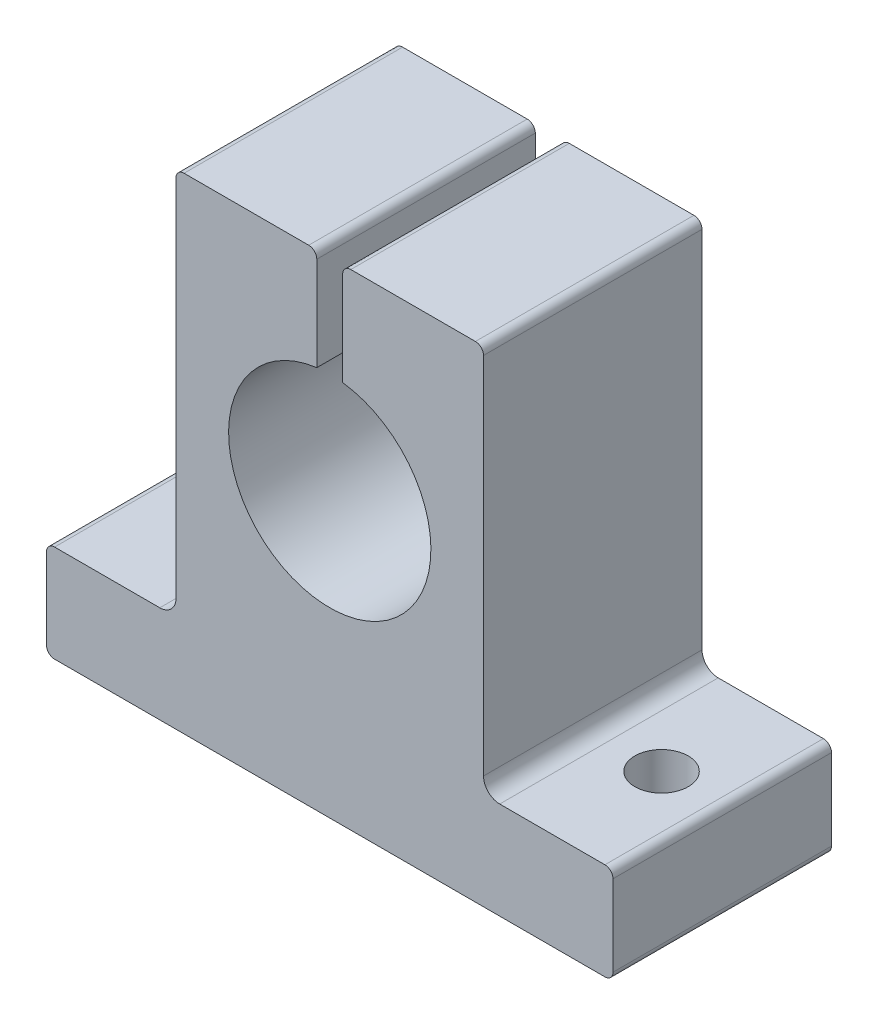
ISO-10303-21;
HEADER;
FILE_DESCRIPTION(('STEP AP214'),'2;1');
FILE_NAME('part.step','',(''),(''),'','','');
FILE_SCHEMA(('AUTOMOTIVE_DESIGN { 1 0 10303 214 1 1 1 1 }'));
ENDSEC;
DATA;
#1=APPLICATION_CONTEXT('core data for automotive mechanical design processes');
#2=APPLICATION_PROTOCOL_DEFINITION('international standard','automotive_design',2000,#1);
#3=PRODUCT_CONTEXT('',#1,'mechanical');
#4=PRODUCT('Part','Part','',(#3));
#5=PRODUCT_RELATED_PRODUCT_CATEGORY('part','',(#4));
#6=PRODUCT_DEFINITION_FORMATION('','',#4);
#7=PRODUCT_DEFINITION_CONTEXT('part definition',#1,'design');
#8=PRODUCT_DEFINITION('design','',#6,#7);
#9=PRODUCT_DEFINITION_SHAPE('','',#8);
#10=(LENGTH_UNIT() NAMED_UNIT(*) SI_UNIT(.MILLI.,.METRE.));
#11=(NAMED_UNIT(*) PLANE_ANGLE_UNIT() SI_UNIT($,.RADIAN.));
#12=(NAMED_UNIT(*) SI_UNIT($,.STERADIAN.) SOLID_ANGLE_UNIT());
#13=UNCERTAINTY_MEASURE_WITH_UNIT(LENGTH_MEASURE(1.E-05),#10,'distance_accuracy_value','');
#14=(GEOMETRIC_REPRESENTATION_CONTEXT(3) GLOBAL_UNCERTAINTY_ASSIGNED_CONTEXT((#13)) GLOBAL_UNIT_ASSIGNED_CONTEXT((#10,
#11,#12)) REPRESENTATION_CONTEXT('',''));
#15=CARTESIAN_POINT('',(0.,0.,0.));
#16=DIRECTION('',(0.,0.,1.));
#17=DIRECTION('',(1.,0.,0.));
#18=AXIS2_PLACEMENT_3D('',#15,#16,#17);
#19=CARTESIAN_POINT('',(-34.,-35.,27.));
#20=DIRECTION('',(0.,1.,0.));
#21=DIRECTION('',(0.,0.,1.));
#22=AXIS2_PLACEMENT_3D('',#19,#20,#21);
#23=PLANE('',#22);
#24=DIRECTION('',(1.,0.,0.));
#25=VECTOR('',#24,1.);
#26=CARTESIAN_POINT('',(-34.,-35.,0.));
#27=LINE('',#26,#25);
#28=CARTESIAN_POINT('',(-34.,-35.,0.));
#29=VERTEX_POINT('',#28);
#30=CARTESIAN_POINT('',(34.,-35.,0.));
#31=VERTEX_POINT('',#30);
#32=EDGE_CURVE('E238',#29,#31,#27,.T.);
#33=ORIENTED_EDGE('',*,*,#32,.T.);
#34=DIRECTION('',(0.,0.,-1.));
#35=VECTOR('',#34,1.);
#36=CARTESIAN_POINT('',(34.,-35.,27.));
#37=LINE('',#36,#35);
#38=CARTESIAN_POINT('',(34.,-35.,27.));
#39=VERTEX_POINT('',#38);
#40=EDGE_CURVE('E279',#39,#31,#37,.T.);
#41=ORIENTED_EDGE('',*,*,#40,.F.);
#42=DIRECTION('',(1.,0.,0.));
#43=VECTOR('',#42,1.);
#44=CARTESIAN_POINT('',(-34.,-35.,27.));
#45=LINE('',#44,#43);
#46=CARTESIAN_POINT('',(-34.,-35.,27.));
#47=VERTEX_POINT('',#46);
#48=EDGE_CURVE('E348',#47,#39,#45,.T.);
#49=ORIENTED_EDGE('',*,*,#48,.F.);
#50=DIRECTION('',(0.,0.,-1.));
#51=VECTOR('',#50,1.);
#52=CARTESIAN_POINT('',(-34.,-35.,27.));
#53=LINE('',#52,#51);
#54=EDGE_CURVE('E282',#47,#29,#53,.T.);
#55=ORIENTED_EDGE('',*,*,#54,.T.);
#56=EDGE_LOOP('',(#33,#41,#49,#55));
#57=FACE_BOUND('',#56,.T.);
#58=CARTESIAN_POINT('',(-27.5,-35.,13.5));
#59=DIRECTION('',(0.,1.,0.));
#60=DIRECTION('',(0.,0.,1.));
#61=AXIS2_PLACEMENT_3D('',#58,#59,#60);
#62=CIRCLE('',#61,3.3);
#63=CARTESIAN_POINT('',(-27.5,-35.,16.8));
#64=VERTEX_POINT('',#63);
#65=EDGE_CURVE('E218',#64,#64,#62,.T.);
#66=ORIENTED_EDGE('',*,*,#65,.T.);
#67=EDGE_LOOP('',(#66));
#68=FACE_BOUND('',#67,.T.);
#69=CARTESIAN_POINT('',(27.5,-35.,13.5));
#70=DIRECTION('',(0.,-1.,0.));
#71=DIRECTION('',(0.,0.,1.));
#72=AXIS2_PLACEMENT_3D('',#69,#70,#71);
#73=CIRCLE('',#72,3.3);
#74=CARTESIAN_POINT('',(27.5,-35.,16.8));
#75=VERTEX_POINT('',#74);
#76=EDGE_CURVE('E642',#75,#75,#73,.T.);
#77=ORIENTED_EDGE('',*,*,#76,.F.);
#78=EDGE_LOOP('',(#77));
#79=FACE_BOUND('',#78,.T.);
#80=ADVANCED_FACE('F33',(#57,#68,#79),#23,.F.);
#81=CARTESIAN_POINT('',(34.,-23.,27.));
#82=DIRECTION('',(0.,-1.,0.));
#83=DIRECTION('',(0.,0.,-1.));
#84=AXIS2_PLACEMENT_3D('',#81,#82,#83);
#85=PLANE('',#84);
#86=DIRECTION('',(-1.,0.,0.));
#87=VECTOR('',#86,1.);
#88=CARTESIAN_POINT('',(34.,-23.,0.));
#89=LINE('',#88,#87);
#90=CARTESIAN_POINT('',(34.,-23.,0.));
#91=VERTEX_POINT('',#90);
#92=CARTESIAN_POINT('',(21.,-23.,0.));
#93=VERTEX_POINT('',#92);
#94=EDGE_CURVE('E246',#91,#93,#89,.T.);
#95=ORIENTED_EDGE('',*,*,#94,.T.);
#96=DIRECTION('',(0.,0.,-1.));
#97=VECTOR('',#96,1.);
#98=CARTESIAN_POINT('',(21.,-23.,27.));
#99=LINE('',#98,#97);
#100=CARTESIAN_POINT('',(21.,-23.,27.));
#101=VERTEX_POINT('',#100);
#102=EDGE_CURVE('E267',#101,#93,#99,.T.);
#103=ORIENTED_EDGE('',*,*,#102,.F.);
#104=DIRECTION('',(-1.,0.,0.));
#105=VECTOR('',#104,1.);
#106=CARTESIAN_POINT('',(34.,-23.,27.));
#107=LINE('',#106,#105);
#108=CARTESIAN_POINT('',(34.,-23.,27.));
#109=VERTEX_POINT('',#108);
#110=EDGE_CURVE('E356',#109,#101,#107,.T.);
#111=ORIENTED_EDGE('',*,*,#110,.F.);
#112=DIRECTION('',(0.,0.,-1.));
#113=VECTOR('',#112,1.);
#114=CARTESIAN_POINT('',(34.,-23.,27.));
#115=LINE('',#114,#113);
#116=EDGE_CURVE('E270',#109,#91,#115,.T.);
#117=ORIENTED_EDGE('',*,*,#116,.T.);
#118=EDGE_LOOP('',(#95,#103,#111,#117));
#119=FACE_BOUND('',#118,.T.);
#120=CARTESIAN_POINT('',(27.5,-23.,13.5));
#121=DIRECTION('',(0.,-1.,0.));
#122=DIRECTION('',(0.,0.,1.));
#123=AXIS2_PLACEMENT_3D('',#120,#121,#122);
#124=CIRCLE('',#123,3.3);
#125=CARTESIAN_POINT('',(27.5,-23.,16.8));
#126=VERTEX_POINT('',#125);
#127=EDGE_CURVE('E640',#126,#126,#124,.T.);
#128=ORIENTED_EDGE('',*,*,#127,.T.);
#129=EDGE_LOOP('',(#128));
#130=FACE_BOUND('',#129,.T.);
#131=ADVANCED_FACE('F385',(#119,#130),#85,.F.);
#132=CARTESIAN_POINT('',(0.,0.,27.));
#133=DIRECTION('',(0.,0.,-1.));
#134=DIRECTION('',(-1.,0.,0.));
#135=AXIS2_PLACEMENT_3D('',#132,#133,#134);
#136=CYLINDRICAL_SURFACE('',#135,12.5);
#137=CARTESIAN_POINT('',(0.,0.,0.));
#138=DIRECTION('',(0.,0.,-1.));
#139=DIRECTION('',(1.,0.,0.));
#140=AXIS2_PLACEMENT_3D('',#137,#138,#139);
#141=CIRCLE('',#140,12.5);
#142=CARTESIAN_POINT('',(1.6,12.3971770980332,0.));
#143=VERTEX_POINT('',#142);
#144=CARTESIAN_POINT('',(-1.6,12.3971770980332,0.));
#145=VERTEX_POINT('',#144);
#146=EDGE_CURVE('E214',#143,#145,#141,.T.);
#147=ORIENTED_EDGE('',*,*,#146,.T.);
#148=DIRECTION('',(0.,0.,-1.));
#149=VECTOR('',#148,1.);
#150=CARTESIAN_POINT('',(-1.6,12.3971770980332,27.));
#151=LINE('',#150,#149);
#152=CARTESIAN_POINT('',(-1.6,12.3971770980332,27.));
#153=VERTEX_POINT('',#152);
#154=EDGE_CURVE('E11',#153,#145,#151,.T.);
#155=ORIENTED_EDGE('',*,*,#154,.F.);
#156=CARTESIAN_POINT('',(0.,0.,27.));
#157=DIRECTION('',(0.,0.,-1.));
#158=DIRECTION('',(1.,0.,0.));
#159=AXIS2_PLACEMENT_3D('',#156,#157,#158);
#160=CIRCLE('',#159,12.5);
#161=CARTESIAN_POINT('',(1.6,12.3971770980332,27.));
#162=VERTEX_POINT('',#161);
#163=EDGE_CURVE('E257',#162,#153,#160,.T.);
#164=ORIENTED_EDGE('',*,*,#163,.F.);
#165=DIRECTION('',(0.,0.,-1.));
#166=VECTOR('',#165,1.);
#167=CARTESIAN_POINT('',(1.6,12.3971770980332,27.));
#168=LINE('',#167,#166);
#169=EDGE_CURVE('E210',#162,#143,#168,.T.);
#170=ORIENTED_EDGE('',*,*,#169,.T.);
#171=EDGE_LOOP('',(#147,#155,#164,#170));
#172=FACE_BOUND('',#171,.T.);
#173=ADVANCED_FACE('F35',(#172),#136,.F.);
#174=CARTESIAN_POINT('',(-1.6,24.,27.));
#175=DIRECTION('',(-1.,0.,0.));
#176=DIRECTION('',(0.,-1.,0.));
#177=AXIS2_PLACEMENT_3D('',#174,#175,#176);
#178=PLANE('',#177);
#179=DIRECTION('',(0.,1.,0.));
#180=VECTOR('',#179,1.);
#181=CARTESIAN_POINT('',(-1.6,24.,0.));
#182=LINE('',#181,#180);
#183=CARTESIAN_POINT('',(-1.6,24.,0.));
#184=VERTEX_POINT('',#183);
#185=EDGE_CURVE('E217',#145,#184,#182,.T.);
#186=ORIENTED_EDGE('',*,*,#185,.T.);
#187=DIRECTION('',(0.,0.,-1.));
#188=VECTOR('',#187,1.);
#189=CARTESIAN_POINT('',(-1.6,24.,27.));
#190=LINE('',#189,#188);
#191=CARTESIAN_POINT('',(-1.6,24.,27.));
#192=VERTEX_POINT('',#191);
#193=EDGE_CURVE('E42',#192,#184,#190,.T.);
#194=ORIENTED_EDGE('',*,*,#193,.F.);
#195=DIRECTION('',(0.,1.,0.));
#196=VECTOR('',#195,1.);
#197=CARTESIAN_POINT('',(-1.6,24.,27.));
#198=LINE('',#197,#196);
#199=EDGE_CURVE('E135',#153,#192,#198,.T.);
#200=ORIENTED_EDGE('',*,*,#199,.F.);
#201=ORIENTED_EDGE('',*,*,#154,.T.);
#202=EDGE_LOOP('',(#186,#194,#200,#201));
#203=FACE_BOUND('',#202,.T.);
#204=ADVANCED_FACE('F427',(#203),#178,.F.);
#205=CARTESIAN_POINT('',(-2.6,24.,27.));
#206=DIRECTION('',(0.,0.,-1.));
#207=DIRECTION('',(-1.,0.,0.));
#208=AXIS2_PLACEMENT_3D('',#205,#206,#207);
#209=CYLINDRICAL_SURFACE('',#208,1.);
#210=CARTESIAN_POINT('',(-2.6,24.,0.));
#211=DIRECTION('',(0.,0.,1.));
#212=DIRECTION('',(-1.,0.,0.));
#213=AXIS2_PLACEMENT_3D('',#210,#211,#212);
#214=CIRCLE('',#213,1.);
#215=CARTESIAN_POINT('',(-2.6,25.,0.));
#216=VERTEX_POINT('',#215);
#217=EDGE_CURVE('E220',#184,#216,#214,.T.);
#218=ORIENTED_EDGE('',*,*,#217,.T.);
#219=DIRECTION('',(0.,0.,-1.));
#220=VECTOR('',#219,1.);
#221=CARTESIAN_POINT('',(-2.6,25.,27.));
#222=LINE('',#221,#220);
#223=CARTESIAN_POINT('',(-2.6,25.,27.));
#224=VERTEX_POINT('',#223);
#225=EDGE_CURVE('E306',#224,#216,#222,.T.);
#226=ORIENTED_EDGE('',*,*,#225,.F.);
#227=CARTESIAN_POINT('',(-2.6,24.,27.));
#228=DIRECTION('',(0.,0.,1.));
#229=DIRECTION('',(-1.,0.,0.));
#230=AXIS2_PLACEMENT_3D('',#227,#228,#229);
#231=CIRCLE('',#230,1.);
#232=EDGE_CURVE('E314',#192,#224,#231,.T.);
#233=ORIENTED_EDGE('',*,*,#232,.F.);
#234=ORIENTED_EDGE('',*,*,#193,.T.);
#235=EDGE_LOOP('',(#218,#226,#233,#234));
#236=FACE_BOUND('',#235,.T.);
#237=ADVANCED_FACE('F312',(#236),#209,.T.);
#238=CARTESIAN_POINT('',(-18.,25.,27.));
#239=DIRECTION('',(0.,-1.,0.));
#240=DIRECTION('',(1.,0.,0.));
#241=AXIS2_PLACEMENT_3D('',#238,#239,#240);
#242=PLANE('',#241);
#243=DIRECTION('',(-1.,0.,0.));
#244=VECTOR('',#243,1.);
#245=CARTESIAN_POINT('',(-18.,25.,0.));
#246=LINE('',#245,#244);
#247=CARTESIAN_POINT('',(-18.,25.,0.));
#248=VERTEX_POINT('',#247);
#249=EDGE_CURVE('E222',#216,#248,#246,.T.);
#250=ORIENTED_EDGE('',*,*,#249,.T.);
#251=DIRECTION('',(0.,0.,-1.));
#252=VECTOR('',#251,1.);
#253=CARTESIAN_POINT('',(-18.,25.,27.));
#254=LINE('',#253,#252);
#255=CARTESIAN_POINT('',(-18.,25.,27.));
#256=VERTEX_POINT('',#255);
#257=EDGE_CURVE('E303',#256,#248,#254,.T.);
#258=ORIENTED_EDGE('',*,*,#257,.F.);
#259=DIRECTION('',(-1.,0.,0.));
#260=VECTOR('',#259,1.);
#261=CARTESIAN_POINT('',(-18.,25.,27.));
#262=LINE('',#261,#260);
#263=EDGE_CURVE('E332',#224,#256,#262,.T.);
#264=ORIENTED_EDGE('',*,*,#263,.F.);
#265=ORIENTED_EDGE('',*,*,#225,.T.);
#266=EDGE_LOOP('',(#250,#258,#264,#265));
#267=FACE_BOUND('',#266,.T.);
#268=ADVANCED_FACE('F323',(#267),#242,.F.);
#269=CARTESIAN_POINT('',(-18.,24.,27.));
#270=DIRECTION('',(0.,0.,-1.));
#271=DIRECTION('',(-1.,0.,0.));
#272=AXIS2_PLACEMENT_3D('',#269,#270,#271);
#273=CYLINDRICAL_SURFACE('',#272,1.);
#274=CARTESIAN_POINT('',(-18.,24.,0.));
#275=DIRECTION('',(0.,0.,1.));
#276=DIRECTION('',(-1.,0.,0.));
#277=AXIS2_PLACEMENT_3D('',#274,#275,#276);
#278=CIRCLE('',#277,1.);
#279=CARTESIAN_POINT('',(-19.,24.,0.));
#280=VERTEX_POINT('',#279);
#281=EDGE_CURVE('E224',#248,#280,#278,.T.);
#282=ORIENTED_EDGE('',*,*,#281,.T.);
#283=DIRECTION('',(0.,0.,-1.));
#284=VECTOR('',#283,1.);
#285=CARTESIAN_POINT('',(-19.,24.,27.));
#286=LINE('',#285,#284);
#287=CARTESIAN_POINT('',(-19.,24.,27.));
#288=VERTEX_POINT('',#287);
#289=EDGE_CURVE('E300',#288,#280,#286,.T.);
#290=ORIENTED_EDGE('',*,*,#289,.F.);
#291=CARTESIAN_POINT('',(-18.,24.,27.));
#292=DIRECTION('',(0.,0.,1.));
#293=DIRECTION('',(-1.,0.,0.));
#294=AXIS2_PLACEMENT_3D('',#291,#292,#293);
#295=CIRCLE('',#294,1.);
#296=EDGE_CURVE('E329',#256,#288,#295,.T.);
#297=ORIENTED_EDGE('',*,*,#296,.F.);
#298=ORIENTED_EDGE('',*,*,#257,.T.);
#299=EDGE_LOOP('',(#282,#290,#297,#298));
#300=FACE_BOUND('',#299,.T.);
#301=ADVANCED_FACE('F327',(#300),#273,.T.);
#302=CARTESIAN_POINT('',(-19.,-21.,27.));
#303=DIRECTION('',(1.,0.,0.));
#304=DIRECTION('',(0.,0.,-1.));
#305=AXIS2_PLACEMENT_3D('',#302,#303,#304);
#306=PLANE('',#305);
#307=DIRECTION('',(0.,-1.,0.));
#308=VECTOR('',#307,1.);
#309=CARTESIAN_POINT('',(-19.,-21.,0.));
#310=LINE('',#309,#308);
#311=CARTESIAN_POINT('',(-19.,-21.,0.));
#312=VERTEX_POINT('',#311);
#313=EDGE_CURVE('E226',#280,#312,#310,.T.);
#314=ORIENTED_EDGE('',*,*,#313,.T.);
#315=DIRECTION('',(0.,0.,-1.));
#316=VECTOR('',#315,1.);
#317=CARTESIAN_POINT('',(-19.,-21.,27.));
#318=LINE('',#317,#316);
#319=CARTESIAN_POINT('',(-19.,-21.,27.));
#320=VERTEX_POINT('',#319);
#321=EDGE_CURVE('E297',#320,#312,#318,.T.);
#322=ORIENTED_EDGE('',*,*,#321,.F.);
#323=DIRECTION('',(0.,-1.,0.));
#324=VECTOR('',#323,1.);
#325=CARTESIAN_POINT('',(-19.,-21.,27.));
#326=LINE('',#325,#324);
#327=EDGE_CURVE('E331',#288,#320,#326,.T.);
#328=ORIENTED_EDGE('',*,*,#327,.F.);
#329=ORIENTED_EDGE('',*,*,#289,.T.);
#330=EDGE_LOOP('',(#314,#322,#328,#329));
#331=FACE_BOUND('',#330,.T.);
#332=ADVANCED_FACE('F417',(#331),#306,.F.);
#333=CARTESIAN_POINT('',(-21.,-21.,27.));
#334=DIRECTION('',(0.,0.,-1.));
#335=DIRECTION('',(-1.,0.,0.));
#336=AXIS2_PLACEMENT_3D('',#333,#334,#335);
#337=CYLINDRICAL_SURFACE('',#336,2.);
#338=CARTESIAN_POINT('',(-21.,-21.,0.));
#339=DIRECTION('',(0.,0.,-1.));
#340=DIRECTION('',(1.,0.,0.));
#341=AXIS2_PLACEMENT_3D('',#338,#339,#340);
#342=CIRCLE('',#341,2.);
#343=CARTESIAN_POINT('',(-21.,-23.,0.));
#344=VERTEX_POINT('',#343);
#345=EDGE_CURVE('E228',#312,#344,#342,.T.);
#346=ORIENTED_EDGE('',*,*,#345,.T.);
#347=DIRECTION('',(0.,0.,-1.));
#348=VECTOR('',#347,1.);
#349=CARTESIAN_POINT('',(-21.,-23.,27.));
#350=LINE('',#349,#348);
#351=CARTESIAN_POINT('',(-21.,-23.,27.));
#352=VERTEX_POINT('',#351);
#353=EDGE_CURVE('E294',#352,#344,#350,.T.);
#354=ORIENTED_EDGE('',*,*,#353,.F.);
#355=CARTESIAN_POINT('',(-21.,-21.,27.));
#356=DIRECTION('',(0.,0.,-1.));
#357=DIRECTION('',(1.,0.,0.));
#358=AXIS2_PLACEMENT_3D('',#355,#356,#357);
#359=CIRCLE('',#358,2.);
#360=EDGE_CURVE('E334',#320,#352,#359,.T.);
#361=ORIENTED_EDGE('',*,*,#360,.F.);
#362=ORIENTED_EDGE('',*,*,#321,.T.);
#363=EDGE_LOOP('',(#346,#354,#361,#362));
#364=FACE_BOUND('',#363,.T.);
#365=ADVANCED_FACE('F413',(#364),#337,.F.);
#366=CARTESIAN_POINT('',(-34.,-23.,27.));
#367=DIRECTION('',(0.,-1.,0.));
#368=DIRECTION('',(0.,0.,-1.));
#369=AXIS2_PLACEMENT_3D('',#366,#367,#368);
#370=PLANE('',#369);
#371=CARTESIAN_POINT('',(-27.5,-23.,13.5));
#372=DIRECTION('',(0.,1.,0.));
#373=DIRECTION('',(0.,0.,1.));
#374=AXIS2_PLACEMENT_3D('',#371,#372,#373);
#375=CIRCLE('',#374,3.3);
#376=CARTESIAN_POINT('',(-27.5,-23.,16.8));
#377=VERTEX_POINT('',#376);
#378=EDGE_CURVE('E645',#377,#377,#375,.T.);
#379=ORIENTED_EDGE('',*,*,#378,.F.);
#380=EDGE_LOOP('',(#379));
#381=FACE_BOUND('',#380,.T.);
#382=DIRECTION('',(-1.,0.,0.));
#383=VECTOR('',#382,1.);
#384=CARTESIAN_POINT('',(-34.,-23.,0.));
#385=LINE('',#384,#383);
#386=CARTESIAN_POINT('',(-34.,-23.,0.));
#387=VERTEX_POINT('',#386);
#388=EDGE_CURVE('E230',#344,#387,#385,.T.);
#389=ORIENTED_EDGE('',*,*,#388,.T.);
#390=DIRECTION('',(0.,0.,-1.));
#391=VECTOR('',#390,1.);
#392=CARTESIAN_POINT('',(-34.,-23.,27.));
#393=LINE('',#392,#391);
#394=CARTESIAN_POINT('',(-34.,-23.,27.));
#395=VERTEX_POINT('',#394);
#396=EDGE_CURVE('E291',#395,#387,#393,.T.);
#397=ORIENTED_EDGE('',*,*,#396,.F.);
#398=DIRECTION('',(-1.,0.,0.));
#399=VECTOR('',#398,1.);
#400=CARTESIAN_POINT('',(-34.,-23.,27.));
#401=LINE('',#400,#399);
#402=EDGE_CURVE('E340',#352,#395,#401,.T.);
#403=ORIENTED_EDGE('',*,*,#402,.F.);
#404=ORIENTED_EDGE('',*,*,#353,.T.);
#405=EDGE_LOOP('',(#389,#397,#403,#404));
#406=FACE_BOUND('',#405,.T.);
#407=ADVANCED_FACE('F409',(#381,#406),#370,.F.);
#408=CARTESIAN_POINT('',(-34.,-24.,27.));
#409=DIRECTION('',(0.,0.,-1.));
#410=DIRECTION('',(-1.,0.,0.));
#411=AXIS2_PLACEMENT_3D('',#408,#409,#410);
#412=CYLINDRICAL_SURFACE('',#411,1.);
#413=CARTESIAN_POINT('',(-34.,-24.,0.));
#414=DIRECTION('',(0.,0.,1.));
#415=DIRECTION('',(-1.,0.,0.));
#416=AXIS2_PLACEMENT_3D('',#413,#414,#415);
#417=CIRCLE('',#416,1.);
#418=CARTESIAN_POINT('',(-35.,-24.,0.));
#419=VERTEX_POINT('',#418);
#420=EDGE_CURVE('E232',#387,#419,#417,.T.);
#421=ORIENTED_EDGE('',*,*,#420,.T.);
#422=DIRECTION('',(0.,0.,-1.));
#423=VECTOR('',#422,1.);
#424=CARTESIAN_POINT('',(-35.,-24.,27.));
#425=LINE('',#424,#423);
#426=CARTESIAN_POINT('',(-35.,-24.,27.));
#427=VERTEX_POINT('',#426);
#428=EDGE_CURVE('E288',#427,#419,#425,.T.);
#429=ORIENTED_EDGE('',*,*,#428,.F.);
#430=CARTESIAN_POINT('',(-34.,-24.,27.));
#431=DIRECTION('',(0.,0.,1.));
#432=DIRECTION('',(-1.,0.,0.));
#433=AXIS2_PLACEMENT_3D('',#430,#431,#432);
#434=CIRCLE('',#433,1.);
#435=EDGE_CURVE('E342',#395,#427,#434,.T.);
#436=ORIENTED_EDGE('',*,*,#435,.F.);
#437=ORIENTED_EDGE('',*,*,#396,.T.);
#438=EDGE_LOOP('',(#421,#429,#436,#437));
#439=FACE_BOUND('',#438,.T.);
#440=ADVANCED_FACE('F405',(#439),#412,.T.);
#441=CARTESIAN_POINT('',(-35.,-34.,27.));
#442=DIRECTION('',(1.,0.,0.));
#443=DIRECTION('',(0.,0.,-1.));
#444=AXIS2_PLACEMENT_3D('',#441,#442,#443);
#445=PLANE('',#444);
#446=DIRECTION('',(0.,-1.,0.));
#447=VECTOR('',#446,1.);
#448=CARTESIAN_POINT('',(-35.,-34.,0.));
#449=LINE('',#448,#447);
#450=CARTESIAN_POINT('',(-35.,-34.,0.));
#451=VERTEX_POINT('',#450);
#452=EDGE_CURVE('E234',#419,#451,#449,.T.);
#453=ORIENTED_EDGE('',*,*,#452,.T.);
#454=DIRECTION('',(0.,0.,-1.));
#455=VECTOR('',#454,1.);
#456=CARTESIAN_POINT('',(-35.,-34.,27.));
#457=LINE('',#456,#455);
#458=CARTESIAN_POINT('',(-35.,-34.,27.));
#459=VERTEX_POINT('',#458);
#460=EDGE_CURVE('E285',#459,#451,#457,.T.);
#461=ORIENTED_EDGE('',*,*,#460,.F.);
#462=DIRECTION('',(0.,-1.,0.));
#463=VECTOR('',#462,1.);
#464=CARTESIAN_POINT('',(-35.,-34.,27.));
#465=LINE('',#464,#463);
#466=EDGE_CURVE('E344',#427,#459,#465,.T.);
#467=ORIENTED_EDGE('',*,*,#466,.F.);
#468=ORIENTED_EDGE('',*,*,#428,.T.);
#469=EDGE_LOOP('',(#453,#461,#467,#468));
#470=FACE_BOUND('',#469,.T.);
#471=ADVANCED_FACE('F401',(#470),#445,.F.);
#472=CARTESIAN_POINT('',(-34.,-34.,27.));
#473=DIRECTION('',(0.,0.,-1.));
#474=DIRECTION('',(-1.,0.,0.));
#475=AXIS2_PLACEMENT_3D('',#472,#473,#474);
#476=CYLINDRICAL_SURFACE('',#475,1.);
#477=CARTESIAN_POINT('',(-34.,-34.,0.));
#478=DIRECTION('',(0.,0.,1.));
#479=DIRECTION('',(1.,0.,0.));
#480=AXIS2_PLACEMENT_3D('',#477,#478,#479);
#481=CIRCLE('',#480,1.);
#482=EDGE_CURVE('E236',#451,#29,#481,.T.);
#483=ORIENTED_EDGE('',*,*,#482,.T.);
#484=ORIENTED_EDGE('',*,*,#54,.F.);
#485=CARTESIAN_POINT('',(-34.,-34.,27.));
#486=DIRECTION('',(0.,0.,1.));
#487=DIRECTION('',(1.,0.,0.));
#488=AXIS2_PLACEMENT_3D('',#485,#486,#487);
#489=CIRCLE('',#488,1.);
#490=EDGE_CURVE('E346',#459,#47,#489,.T.);
#491=ORIENTED_EDGE('',*,*,#490,.F.);
#492=ORIENTED_EDGE('',*,*,#460,.T.);
#493=EDGE_LOOP('',(#483,#484,#491,#492));
#494=FACE_BOUND('',#493,.T.);
#495=ADVANCED_FACE('F398',(#494),#476,.T.);
#496=CARTESIAN_POINT('',(34.,-34.,27.));
#497=DIRECTION('',(0.,0.,-1.));
#498=DIRECTION('',(-1.,0.,0.));
#499=AXIS2_PLACEMENT_3D('',#496,#497,#498);
#500=CYLINDRICAL_SURFACE('',#499,1.);
#501=CARTESIAN_POINT('',(34.,-34.,0.));
#502=DIRECTION('',(0.,0.,1.));
#503=DIRECTION('',(-1.,0.,0.));
#504=AXIS2_PLACEMENT_3D('',#501,#502,#503);
#505=CIRCLE('',#504,1.);
#506=CARTESIAN_POINT('',(35.,-34.,0.));
#507=VERTEX_POINT('',#506);
#508=EDGE_CURVE('E240',#31,#507,#505,.T.);
#509=ORIENTED_EDGE('',*,*,#508,.T.);
#510=DIRECTION('',(0.,0.,-1.));
#511=VECTOR('',#510,1.);
#512=CARTESIAN_POINT('',(35.,-34.,27.));
#513=LINE('',#512,#511);
#514=CARTESIAN_POINT('',(35.,-34.,27.));
#515=VERTEX_POINT('',#514);
#516=EDGE_CURVE('E276',#515,#507,#513,.T.);
#517=ORIENTED_EDGE('',*,*,#516,.F.);
#518=CARTESIAN_POINT('',(34.,-34.,27.));
#519=DIRECTION('',(0.,0.,1.));
#520=DIRECTION('',(-1.,0.,0.));
#521=AXIS2_PLACEMENT_3D('',#518,#519,#520);
#522=CIRCLE('',#521,1.);
#523=EDGE_CURVE('E350',#39,#515,#522,.T.);
#524=ORIENTED_EDGE('',*,*,#523,.F.);
#525=ORIENTED_EDGE('',*,*,#40,.T.);
#526=EDGE_LOOP('',(#509,#517,#524,#525));
#527=FACE_BOUND('',#526,.T.);
#528=ADVANCED_FACE('F396',(#527),#500,.T.);
#529=CARTESIAN_POINT('',(35.,-34.,27.));
#530=DIRECTION('',(-1.,0.,0.));
#531=DIRECTION('',(0.,0.,1.));
#532=AXIS2_PLACEMENT_3D('',#529,#530,#531);
#533=PLANE('',#532);
#534=DIRECTION('',(0.,1.,0.));
#535=VECTOR('',#534,1.);
#536=CARTESIAN_POINT('',(35.,-34.,0.));
#537=LINE('',#536,#535);
#538=CARTESIAN_POINT('',(35.,-24.,0.));
#539=VERTEX_POINT('',#538);
#540=EDGE_CURVE('E242',#507,#539,#537,.T.);
#541=ORIENTED_EDGE('',*,*,#540,.T.);
#542=DIRECTION('',(0.,0.,-1.));
#543=VECTOR('',#542,1.);
#544=CARTESIAN_POINT('',(35.,-24.,27.));
#545=LINE('',#544,#543);
#546=CARTESIAN_POINT('',(35.,-24.,27.));
#547=VERTEX_POINT('',#546);
#548=EDGE_CURVE('E273',#547,#539,#545,.T.);
#549=ORIENTED_EDGE('',*,*,#548,.F.);
#550=DIRECTION('',(0.,1.,0.));
#551=VECTOR('',#550,1.);
#552=CARTESIAN_POINT('',(35.,-34.,27.));
#553=LINE('',#552,#551);
#554=EDGE_CURVE('E352',#515,#547,#553,.T.);
#555=ORIENTED_EDGE('',*,*,#554,.F.);
#556=ORIENTED_EDGE('',*,*,#516,.T.);
#557=EDGE_LOOP('',(#541,#549,#555,#556));
#558=FACE_BOUND('',#557,.T.);
#559=ADVANCED_FACE('F524',(#558),#533,.F.);
#560=CARTESIAN_POINT('',(34.,-24.,27.));
#561=DIRECTION('',(0.,0.,-1.));
#562=DIRECTION('',(-1.,0.,0.));
#563=AXIS2_PLACEMENT_3D('',#560,#561,#562);
#564=CYLINDRICAL_SURFACE('',#563,1.);
#565=CARTESIAN_POINT('',(34.,-24.,0.));
#566=DIRECTION('',(0.,0.,1.));
#567=DIRECTION('',(1.,0.,0.));
#568=AXIS2_PLACEMENT_3D('',#565,#566,#567);
#569=CIRCLE('',#568,1.);
#570=EDGE_CURVE('E244',#539,#91,#569,.T.);
#571=ORIENTED_EDGE('',*,*,#570,.T.);
#572=ORIENTED_EDGE('',*,*,#116,.F.);
#573=CARTESIAN_POINT('',(34.,-24.,27.));
#574=DIRECTION('',(0.,0.,1.));
#575=DIRECTION('',(1.,0.,0.));
#576=AXIS2_PLACEMENT_3D('',#573,#574,#575);
#577=CIRCLE('',#576,1.);
#578=EDGE_CURVE('E354',#547,#109,#577,.T.);
#579=ORIENTED_EDGE('',*,*,#578,.F.);
#580=ORIENTED_EDGE('',*,*,#548,.T.);
#581=EDGE_LOOP('',(#571,#572,#579,#580));
#582=FACE_BOUND('',#581,.T.);
#583=ADVANCED_FACE('F514',(#582),#564,.T.);
#584=CARTESIAN_POINT('',(21.,-21.,27.));
#585=DIRECTION('',(0.,0.,-1.));
#586=DIRECTION('',(-1.,0.,0.));
#587=AXIS2_PLACEMENT_3D('',#584,#585,#586);
#588=CYLINDRICAL_SURFACE('',#587,2.);
#589=CARTESIAN_POINT('',(21.,-21.,0.));
#590=DIRECTION('',(0.,0.,-1.));
#591=DIRECTION('',(-1.,0.,0.));
#592=AXIS2_PLACEMENT_3D('',#589,#590,#591);
#593=CIRCLE('',#592,2.);
#594=CARTESIAN_POINT('',(19.,-21.,0.));
#595=VERTEX_POINT('',#594);
#596=EDGE_CURVE('E248',#93,#595,#593,.T.);
#597=ORIENTED_EDGE('',*,*,#596,.T.);
#598=DIRECTION('',(0.,0.,-1.));
#599=VECTOR('',#598,1.);
#600=CARTESIAN_POINT('',(19.,-21.,27.));
#601=LINE('',#600,#599);
#602=CARTESIAN_POINT('',(19.,-21.,27.));
#603=VERTEX_POINT('',#602);
#604=EDGE_CURVE('E264',#603,#595,#601,.T.);
#605=ORIENTED_EDGE('',*,*,#604,.F.);
#606=CARTESIAN_POINT('',(21.,-21.,27.));
#607=DIRECTION('',(0.,0.,-1.));
#608=DIRECTION('',(-1.,0.,0.));
#609=AXIS2_PLACEMENT_3D('',#606,#607,#608);
#610=CIRCLE('',#609,2.);
#611=EDGE_CURVE('E358',#101,#603,#610,.T.);
#612=ORIENTED_EDGE('',*,*,#611,.F.);
#613=ORIENTED_EDGE('',*,*,#102,.T.);
#614=EDGE_LOOP('',(#597,#605,#612,#613));
#615=FACE_BOUND('',#614,.T.);
#616=ADVANCED_FACE('F505',(#615),#588,.F.);
#617=CARTESIAN_POINT('',(19.,-21.,27.));
#618=DIRECTION('',(-1.,0.,0.));
#619=DIRECTION('',(0.,-1.,0.));
#620=AXIS2_PLACEMENT_3D('',#617,#618,#619);
#621=PLANE('',#620);
#622=DIRECTION('',(0.,1.,0.));
#623=VECTOR('',#622,1.);
#624=CARTESIAN_POINT('',(19.,-21.,0.));
#625=LINE('',#624,#623);
#626=CARTESIAN_POINT('',(19.,24.,0.));
#627=VERTEX_POINT('',#626);
#628=EDGE_CURVE('E250',#595,#627,#625,.T.);
#629=ORIENTED_EDGE('',*,*,#628,.T.);
#630=DIRECTION('',(0.,0.,-1.));
#631=VECTOR('',#630,1.);
#632=CARTESIAN_POINT('',(19.,24.,27.));
#633=LINE('',#632,#631);
#634=CARTESIAN_POINT('',(19.,24.,27.));
#635=VERTEX_POINT('',#634);
#636=EDGE_CURVE('E261',#635,#627,#633,.T.);
#637=ORIENTED_EDGE('',*,*,#636,.F.);
#638=DIRECTION('',(0.,1.,0.));
#639=VECTOR('',#638,1.);
#640=CARTESIAN_POINT('',(19.,-21.,27.));
#641=LINE('',#640,#639);
#642=EDGE_CURVE('E360',#603,#635,#641,.T.);
#643=ORIENTED_EDGE('',*,*,#642,.F.);
#644=ORIENTED_EDGE('',*,*,#604,.T.);
#645=EDGE_LOOP('',(#629,#637,#643,#644));
#646=FACE_BOUND('',#645,.T.);
#647=ADVANCED_FACE('F366',(#646),#621,.F.);
#648=CARTESIAN_POINT('',(18.,24.,27.));
#649=DIRECTION('',(0.,0.,-1.));
#650=DIRECTION('',(-1.,0.,0.));
#651=AXIS2_PLACEMENT_3D('',#648,#649,#650);
#652=CYLINDRICAL_SURFACE('',#651,1.);
#653=CARTESIAN_POINT('',(18.,24.,0.));
#654=DIRECTION('',(0.,0.,1.));
#655=DIRECTION('',(1.,0.,0.));
#656=AXIS2_PLACEMENT_3D('',#653,#654,#655);
#657=CIRCLE('',#656,1.);
#658=CARTESIAN_POINT('',(18.,25.,0.));
#659=VERTEX_POINT('',#658);
#660=EDGE_CURVE('E252',#627,#659,#657,.T.);
#661=ORIENTED_EDGE('',*,*,#660,.T.);
#662=DIRECTION('',(0.,0.,-1.));
#663=VECTOR('',#662,1.);
#664=CARTESIAN_POINT('',(18.,25.,27.));
#665=LINE('',#664,#663);
#666=CARTESIAN_POINT('',(18.,25.,27.));
#667=VERTEX_POINT('',#666);
#668=EDGE_CURVE('E205',#667,#659,#665,.T.);
#669=ORIENTED_EDGE('',*,*,#668,.F.);
#670=CARTESIAN_POINT('',(18.,24.,27.));
#671=DIRECTION('',(0.,0.,1.));
#672=DIRECTION('',(1.,0.,0.));
#673=AXIS2_PLACEMENT_3D('',#670,#671,#672);
#674=CIRCLE('',#673,1.);
#675=EDGE_CURVE('E196',#635,#667,#674,.T.);
#676=ORIENTED_EDGE('',*,*,#675,.F.);
#677=ORIENTED_EDGE('',*,*,#636,.T.);
#678=EDGE_LOOP('',(#661,#669,#676,#677));
#679=FACE_BOUND('',#678,.T.);
#680=ADVANCED_FACE('F370',(#679),#652,.T.);
#681=CARTESIAN_POINT('',(18.,25.,27.));
#682=DIRECTION('',(0.,-1.,0.));
#683=DIRECTION('',(1.,0.,0.));
#684=AXIS2_PLACEMENT_3D('',#681,#682,#683);
#685=PLANE('',#684);
#686=DIRECTION('',(-1.,0.,0.));
#687=VECTOR('',#686,1.);
#688=CARTESIAN_POINT('',(18.,25.,0.));
#689=LINE('',#688,#687);
#690=CARTESIAN_POINT('',(2.6,25.,0.));
#691=VERTEX_POINT('',#690);
#692=EDGE_CURVE('E204',#659,#691,#689,.T.);
#693=ORIENTED_EDGE('',*,*,#692,.T.);
#694=DIRECTION('',(0.,0.,-1.));
#695=VECTOR('',#694,1.);
#696=CARTESIAN_POINT('',(2.6,25.,27.));
#697=LINE('',#696,#695);
#698=CARTESIAN_POINT('',(2.6,25.,27.));
#699=VERTEX_POINT('',#698);
#700=EDGE_CURVE('E201',#699,#691,#697,.T.);
#701=ORIENTED_EDGE('',*,*,#700,.F.);
#702=DIRECTION('',(-1.,0.,0.));
#703=VECTOR('',#702,1.);
#704=CARTESIAN_POINT('',(18.,25.,27.));
#705=LINE('',#704,#703);
#706=EDGE_CURVE('E190',#667,#699,#705,.T.);
#707=ORIENTED_EDGE('',*,*,#706,.F.);
#708=ORIENTED_EDGE('',*,*,#668,.T.);
#709=EDGE_LOOP('',(#693,#701,#707,#708));
#710=FACE_BOUND('',#709,.T.);
#711=ADVANCED_FACE('F202',(#710),#685,.F.);
#712=CARTESIAN_POINT('',(2.6,24.,27.));
#713=DIRECTION('',(0.,0.,-1.));
#714=DIRECTION('',(-1.,0.,0.));
#715=AXIS2_PLACEMENT_3D('',#712,#713,#714);
#716=CYLINDRICAL_SURFACE('',#715,1.);
#717=CARTESIAN_POINT('',(2.6,24.,0.));
#718=DIRECTION('',(0.,0.,1.));
#719=DIRECTION('',(1.,0.,0.));
#720=AXIS2_PLACEMENT_3D('',#717,#718,#719);
#721=CIRCLE('',#720,1.);
#722=CARTESIAN_POINT('',(1.59999999999999,24.,0.));
#723=VERTEX_POINT('',#722);
#724=EDGE_CURVE('E121',#691,#723,#721,.T.);
#725=ORIENTED_EDGE('',*,*,#724,.T.);
#726=DIRECTION('',(0.,0.,-1.));
#727=VECTOR('',#726,1.);
#728=CARTESIAN_POINT('',(1.59999999999999,24.,27.));
#729=LINE('',#728,#727);
#730=CARTESIAN_POINT('',(1.59999999999999,24.,27.));
#731=VERTEX_POINT('',#730);
#732=EDGE_CURVE('E206',#731,#723,#729,.T.);
#733=ORIENTED_EDGE('',*,*,#732,.F.);
#734=CARTESIAN_POINT('',(2.6,24.,27.));
#735=DIRECTION('',(0.,0.,1.));
#736=DIRECTION('',(1.,0.,0.));
#737=AXIS2_PLACEMENT_3D('',#734,#735,#736);
#738=CIRCLE('',#737,1.);
#739=EDGE_CURVE('E194',#699,#731,#738,.T.);
#740=ORIENTED_EDGE('',*,*,#739,.F.);
#741=ORIENTED_EDGE('',*,*,#700,.T.);
#742=EDGE_LOOP('',(#725,#733,#740,#741));
#743=FACE_BOUND('',#742,.T.);
#744=ADVANCED_FACE('F208',(#743),#716,.T.);
#745=CARTESIAN_POINT('',(1.6,24.,27.));
#746=DIRECTION('',(1.,0.,0.));
#747=DIRECTION('',(0.,1.,0.));
#748=AXIS2_PLACEMENT_3D('',#745,#746,#747);
#749=PLANE('',#748);
#750=DIRECTION('',(0.,-1.,0.));
#751=VECTOR('',#750,1.);
#752=CARTESIAN_POINT('',(1.6,24.,0.));
#753=LINE('',#752,#751);
#754=EDGE_CURVE('E127',#723,#143,#753,.T.);
#755=ORIENTED_EDGE('',*,*,#754,.T.);
#756=ORIENTED_EDGE('',*,*,#169,.F.);
#757=DIRECTION('',(0.,-1.,0.));
#758=VECTOR('',#757,1.);
#759=CARTESIAN_POINT('',(1.6,24.,27.));
#760=LINE('',#759,#758);
#761=EDGE_CURVE('E50',#731,#162,#760,.T.);
#762=ORIENTED_EDGE('',*,*,#761,.F.);
#763=ORIENTED_EDGE('',*,*,#732,.T.);
#764=EDGE_LOOP('',(#755,#756,#762,#763));
#765=FACE_BOUND('',#764,.T.);
#766=ADVANCED_FACE('F374',(#765),#749,.F.);
#767=CARTESIAN_POINT('',(0.,0.,27.));
#768=DIRECTION('',(0.,0.,1.));
#769=DIRECTION('',(1.,0.,0.));
#770=AXIS2_PLACEMENT_3D('',#767,#768,#769);
#771=PLANE('',#770);
#772=ORIENTED_EDGE('',*,*,#163,.T.);
#773=ORIENTED_EDGE('',*,*,#199,.T.);
#774=ORIENTED_EDGE('',*,*,#232,.T.);
#775=ORIENTED_EDGE('',*,*,#263,.T.);
#776=ORIENTED_EDGE('',*,*,#296,.T.);
#777=ORIENTED_EDGE('',*,*,#327,.T.);
#778=ORIENTED_EDGE('',*,*,#360,.T.);
#779=ORIENTED_EDGE('',*,*,#402,.T.);
#780=ORIENTED_EDGE('',*,*,#435,.T.);
#781=ORIENTED_EDGE('',*,*,#466,.T.);
#782=ORIENTED_EDGE('',*,*,#490,.T.);
#783=ORIENTED_EDGE('',*,*,#48,.T.);
#784=ORIENTED_EDGE('',*,*,#523,.T.);
#785=ORIENTED_EDGE('',*,*,#554,.T.);
#786=ORIENTED_EDGE('',*,*,#578,.T.);
#787=ORIENTED_EDGE('',*,*,#110,.T.);
#788=ORIENTED_EDGE('',*,*,#611,.T.);
#789=ORIENTED_EDGE('',*,*,#642,.T.);
#790=ORIENTED_EDGE('',*,*,#675,.T.);
#791=ORIENTED_EDGE('',*,*,#706,.T.);
#792=ORIENTED_EDGE('',*,*,#739,.T.);
#793=ORIENTED_EDGE('',*,*,#761,.T.);
#794=EDGE_LOOP('',(#772,#773,#774,#775,#776,#777,#778,#779,#780,#781,#782,#783,#784,#785,#786,
#787,#788,#789,#790,#791,#792,#793));
#795=FACE_BOUND('',#794,.T.);
#796=ADVANCED_FACE('F192',(#795),#771,.T.);
#797=CARTESIAN_POINT('',(0.,0.,0.));
#798=DIRECTION('',(0.,0.,1.));
#799=DIRECTION('',(1.,0.,0.));
#800=AXIS2_PLACEMENT_3D('',#797,#798,#799);
#801=PLANE('',#800);
#802=ORIENTED_EDGE('',*,*,#146,.F.);
#803=ORIENTED_EDGE('',*,*,#754,.F.);
#804=ORIENTED_EDGE('',*,*,#724,.F.);
#805=ORIENTED_EDGE('',*,*,#692,.F.);
#806=ORIENTED_EDGE('',*,*,#660,.F.);
#807=ORIENTED_EDGE('',*,*,#628,.F.);
#808=ORIENTED_EDGE('',*,*,#596,.F.);
#809=ORIENTED_EDGE('',*,*,#94,.F.);
#810=ORIENTED_EDGE('',*,*,#570,.F.);
#811=ORIENTED_EDGE('',*,*,#540,.F.);
#812=ORIENTED_EDGE('',*,*,#508,.F.);
#813=ORIENTED_EDGE('',*,*,#32,.F.);
#814=ORIENTED_EDGE('',*,*,#482,.F.);
#815=ORIENTED_EDGE('',*,*,#452,.F.);
#816=ORIENTED_EDGE('',*,*,#420,.F.);
#817=ORIENTED_EDGE('',*,*,#388,.F.);
#818=ORIENTED_EDGE('',*,*,#345,.F.);
#819=ORIENTED_EDGE('',*,*,#313,.F.);
#820=ORIENTED_EDGE('',*,*,#281,.F.);
#821=ORIENTED_EDGE('',*,*,#249,.F.);
#822=ORIENTED_EDGE('',*,*,#217,.F.);
#823=ORIENTED_EDGE('',*,*,#185,.F.);
#824=EDGE_LOOP('',(#802,#803,#804,#805,#806,#807,#808,#809,#810,#811,#812,#813,#814,#815,#816,
#817,#818,#819,#820,#821,#822,#823));
#825=FACE_BOUND('',#824,.T.);
#826=ADVANCED_FACE('F318',(#825),#801,.F.);
#827=CARTESIAN_POINT('',(-27.5,-35.,13.5));
#828=DIRECTION('',(0.,1.,0.));
#829=DIRECTION('',(0.,0.,1.));
#830=AXIS2_PLACEMENT_3D('',#827,#828,#829);
#831=CYLINDRICAL_SURFACE('',#830,3.3);
#832=ORIENTED_EDGE('',*,*,#65,.F.);
#833=EDGE_LOOP('',(#832));
#834=FACE_BOUND('',#833,.T.);
#835=ORIENTED_EDGE('',*,*,#378,.T.);
#836=EDGE_LOOP('',(#835));
#837=FACE_BOUND('',#836,.T.);
#838=ADVANCED_FACE('F451',(#834,#837),#831,.F.);
#839=CARTESIAN_POINT('',(27.5,-35.,13.5));
#840=DIRECTION('',(0.,1.,0.));
#841=DIRECTION('',(0.,0.,1.));
#842=AXIS2_PLACEMENT_3D('',#839,#840,#841);
#843=CYLINDRICAL_SURFACE('',#842,3.3);
#844=ORIENTED_EDGE('',*,*,#76,.T.);
#845=EDGE_LOOP('',(#844));
#846=FACE_BOUND('',#845,.T.);
#847=ORIENTED_EDGE('',*,*,#127,.F.);
#848=EDGE_LOOP('',(#847));
#849=FACE_BOUND('',#848,.T.);
#850=ADVANCED_FACE('F447',(#846,#849),#843,.F.);
#851=CLOSED_SHELL('',(#80,#131,#173,#204,#237,#268,#301,#332,#365,#407,#440,#471,#495,#528,#559,
#583,#616,#647,#680,#711,#744,#766,#796,#826,#838,#850));
#852=MANIFOLD_SOLID_BREP('B2',#851);
#853=ADVANCED_BREP_SHAPE_REPRESENTATION('',(#18,#852),#14);
#854=SHAPE_DEFINITION_REPRESENTATION(#9,#853);
ENDSEC;
END-ISO-10303-21;
